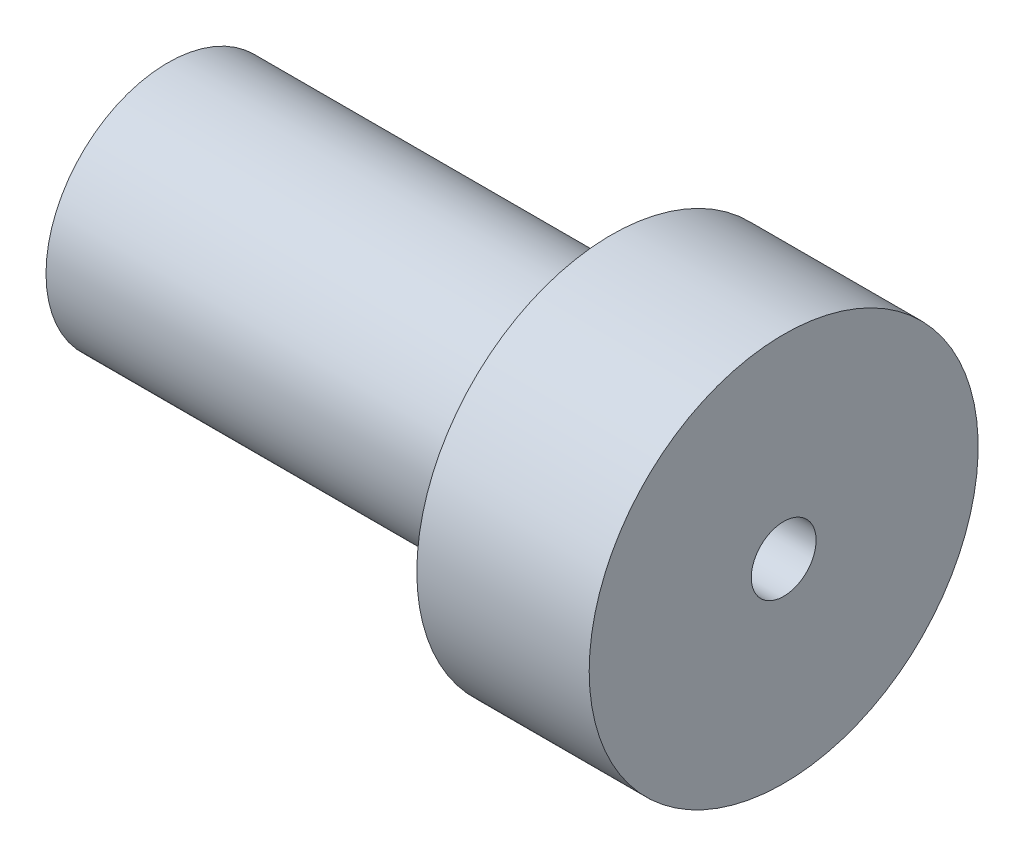
ISO-10303-21;
HEADER;
FILE_DESCRIPTION(('STEP AP214'),'2;1');
FILE_NAME('part.step','',(''),(''),'','','');
FILE_SCHEMA(('AUTOMOTIVE_DESIGN { 1 0 10303 214 1 1 1 1 }'));
ENDSEC;
DATA;
#1=APPLICATION_CONTEXT('core data for automotive mechanical design processes');
#2=APPLICATION_PROTOCOL_DEFINITION('international standard','automotive_design',2000,#1);
#3=PRODUCT_CONTEXT('',#1,'mechanical');
#4=PRODUCT('Part','Part','',(#3));
#5=PRODUCT_RELATED_PRODUCT_CATEGORY('part','',(#4));
#6=PRODUCT_DEFINITION_FORMATION('','',#4);
#7=PRODUCT_DEFINITION_CONTEXT('part definition',#1,'design');
#8=PRODUCT_DEFINITION('design','',#6,#7);
#9=PRODUCT_DEFINITION_SHAPE('','',#8);
#10=(LENGTH_UNIT() NAMED_UNIT(*) SI_UNIT(.MILLI.,.METRE.));
#11=(NAMED_UNIT(*) PLANE_ANGLE_UNIT() SI_UNIT($,.RADIAN.));
#12=(NAMED_UNIT(*) SI_UNIT($,.STERADIAN.) SOLID_ANGLE_UNIT());
#13=UNCERTAINTY_MEASURE_WITH_UNIT(LENGTH_MEASURE(1.E-05),#10,'distance_accuracy_value','');
#14=(GEOMETRIC_REPRESENTATION_CONTEXT(3) GLOBAL_UNCERTAINTY_ASSIGNED_CONTEXT((#13)) GLOBAL_UNIT_ASSIGNED_CONTEXT((#10,
#11,#12)) REPRESENTATION_CONTEXT('',''));
#15=CARTESIAN_POINT('',(0.,0.,0.));
#16=DIRECTION('',(0.,0.,1.));
#17=DIRECTION('',(1.,0.,0.));
#18=AXIS2_PLACEMENT_3D('',#15,#16,#17);
#19=CARTESIAN_POINT('',(0.,0.,0.));
#20=DIRECTION('',(1.,0.,0.));
#21=DIRECTION('',(0.,0.,-1.));
#22=AXIS2_PLACEMENT_3D('',#19,#20,#21);
#23=PLANE('',#22);
#24=CARTESIAN_POINT('',(0.,0.,0.));
#25=DIRECTION('',(1.,0.,0.));
#26=DIRECTION('',(0.,0.,-1.));
#27=AXIS2_PLACEMENT_3D('',#24,#25,#26);
#28=CIRCLE('',#27,1.);
#29=CARTESIAN_POINT('',(0.,0.,-1.));
#30=VERTEX_POINT('',#29);
#31=EDGE_CURVE('E61',#30,#30,#28,.T.);
#32=ORIENTED_EDGE('',*,*,#31,.T.);
#33=EDGE_LOOP('',(#32));
#34=FACE_BOUND('',#33,.T.);
#35=CARTESIAN_POINT('',(0.,0.,0.));
#36=DIRECTION('',(-1.,0.,0.));
#37=DIRECTION('',(0.,0.,1.));
#38=AXIS2_PLACEMENT_3D('',#35,#36,#37);
#39=CIRCLE('',#38,3.75746268656716);
#40=CARTESIAN_POINT('',(0.,0.,3.75746268656716));
#41=VERTEX_POINT('',#40);
#42=EDGE_CURVE('E10',#41,#41,#39,.T.);
#43=ORIENTED_EDGE('',*,*,#42,.T.);
#44=EDGE_LOOP('',(#43));
#45=FACE_BOUND('',#44,.T.);
#46=ADVANCED_FACE('F37',(#34,#45),#23,.F.);
#47=CARTESIAN_POINT('',(-5.95522388059701,0.,0.));
#48=DIRECTION('',(-1.,0.,0.));
#49=DIRECTION('',(0.,0.,1.));
#50=AXIS2_PLACEMENT_3D('',#47,#48,#49);
#51=CYLINDRICAL_SURFACE('',#50,3.75746268656716);
#52=ORIENTED_EDGE('',*,*,#42,.F.);
#53=EDGE_LOOP('',(#52));
#54=FACE_BOUND('',#53,.T.);
#55=CARTESIAN_POINT('',(13.6828358208955,0.,0.));
#56=DIRECTION('',(-1.,0.,0.));
#57=DIRECTION('',(0.,0.,1.));
#58=AXIS2_PLACEMENT_3D('',#55,#56,#57);
#59=CIRCLE('',#58,3.75746268656716);
#60=CARTESIAN_POINT('',(13.6828358208955,0.,3.75746268656716));
#61=VERTEX_POINT('',#60);
#62=EDGE_CURVE('E44',#61,#61,#59,.T.);
#63=ORIENTED_EDGE('',*,*,#62,.T.);
#64=EDGE_LOOP('',(#63));
#65=FACE_BOUND('',#64,.T.);
#66=ADVANCED_FACE('F86',(#54,#65),#51,.T.);
#67=CARTESIAN_POINT('',(13.6828358208955,3.75746268656716,0.));
#68=DIRECTION('',(1.,0.,0.));
#69=DIRECTION('',(0.,0.,-1.));
#70=AXIS2_PLACEMENT_3D('',#67,#68,#69);
#71=PLANE('',#70);
#72=ORIENTED_EDGE('',*,*,#62,.F.);
#73=EDGE_LOOP('',(#72));
#74=FACE_BOUND('',#73,.T.);
#75=CARTESIAN_POINT('',(13.6828358208955,0.,0.));
#76=DIRECTION('',(-1.,0.,0.));
#77=DIRECTION('',(0.,0.,1.));
#78=AXIS2_PLACEMENT_3D('',#75,#76,#77);
#79=CIRCLE('',#78,6.);
#80=CARTESIAN_POINT('',(13.6828358208955,0.,6.));
#81=VERTEX_POINT('',#80);
#82=EDGE_CURVE('E49',#81,#81,#79,.T.);
#83=ORIENTED_EDGE('',*,*,#82,.T.);
#84=EDGE_LOOP('',(#83));
#85=FACE_BOUND('',#84,.T.);
#86=ADVANCED_FACE('F80',(#74,#85),#71,.F.);
#87=CARTESIAN_POINT('',(-5.95522388059701,0.,0.));
#88=DIRECTION('',(-1.,0.,0.));
#89=DIRECTION('',(0.,0.,1.));
#90=AXIS2_PLACEMENT_3D('',#87,#88,#89);
#91=CYLINDRICAL_SURFACE('',#90,6.);
#92=ORIENTED_EDGE('',*,*,#82,.F.);
#93=EDGE_LOOP('',(#92));
#94=FACE_BOUND('',#93,.T.);
#95=CARTESIAN_POINT('',(19.,0.,0.));
#96=DIRECTION('',(-1.,0.,0.));
#97=DIRECTION('',(0.,0.,1.));
#98=AXIS2_PLACEMENT_3D('',#95,#96,#97);
#99=CIRCLE('',#98,6.);
#100=CARTESIAN_POINT('',(19.,0.,6.));
#101=VERTEX_POINT('',#100);
#102=EDGE_CURVE('E54',#101,#101,#99,.T.);
#103=ORIENTED_EDGE('',*,*,#102,.T.);
#104=EDGE_LOOP('',(#103));
#105=FACE_BOUND('',#104,.T.);
#106=ADVANCED_FACE('F75',(#94,#105),#91,.T.);
#107=CARTESIAN_POINT('',(19.,6.,0.));
#108=DIRECTION('',(-1.,0.,0.));
#109=DIRECTION('',(0.,0.,1.));
#110=AXIS2_PLACEMENT_3D('',#107,#108,#109);
#111=PLANE('',#110);
#112=CARTESIAN_POINT('',(19.,0.,0.));
#113=DIRECTION('',(1.,0.,0.));
#114=DIRECTION('',(0.,0.,-1.));
#115=AXIS2_PLACEMENT_3D('',#112,#113,#114);
#116=CIRCLE('',#115,1.);
#117=CARTESIAN_POINT('',(19.,0.,-1.));
#118=VERTEX_POINT('',#117);
#119=EDGE_CURVE('E60',#118,#118,#116,.T.);
#120=ORIENTED_EDGE('',*,*,#119,.F.);
#121=EDGE_LOOP('',(#120));
#122=FACE_BOUND('',#121,.T.);
#123=ORIENTED_EDGE('',*,*,#102,.F.);
#124=EDGE_LOOP('',(#123));
#125=FACE_BOUND('',#124,.T.);
#126=ADVANCED_FACE('F72',(#122,#125),#111,.F.);
#127=CARTESIAN_POINT('',(19.,0.,0.));
#128=DIRECTION('',(-1.,0.,0.));
#129=DIRECTION('',(0.,0.,1.));
#130=AXIS2_PLACEMENT_3D('',#127,#128,#129);
#131=CYLINDRICAL_SURFACE('',#130,1.);
#132=ORIENTED_EDGE('',*,*,#119,.T.);
#133=EDGE_LOOP('',(#132));
#134=FACE_BOUND('',#133,.T.);
#135=ORIENTED_EDGE('',*,*,#31,.F.);
#136=EDGE_LOOP('',(#135));
#137=FACE_BOUND('',#136,.T.);
#138=ADVANCED_FACE('F69',(#134,#137),#131,.F.);
#139=CLOSED_SHELL('',(#46,#66,#86,#106,#126,#138));
#140=MANIFOLD_SOLID_BREP('B2',#139);
#141=ADVANCED_BREP_SHAPE_REPRESENTATION('',(#18,#140),#14);
#142=SHAPE_DEFINITION_REPRESENTATION(#9,#141);
ENDSEC;
END-ISO-10303-21;
